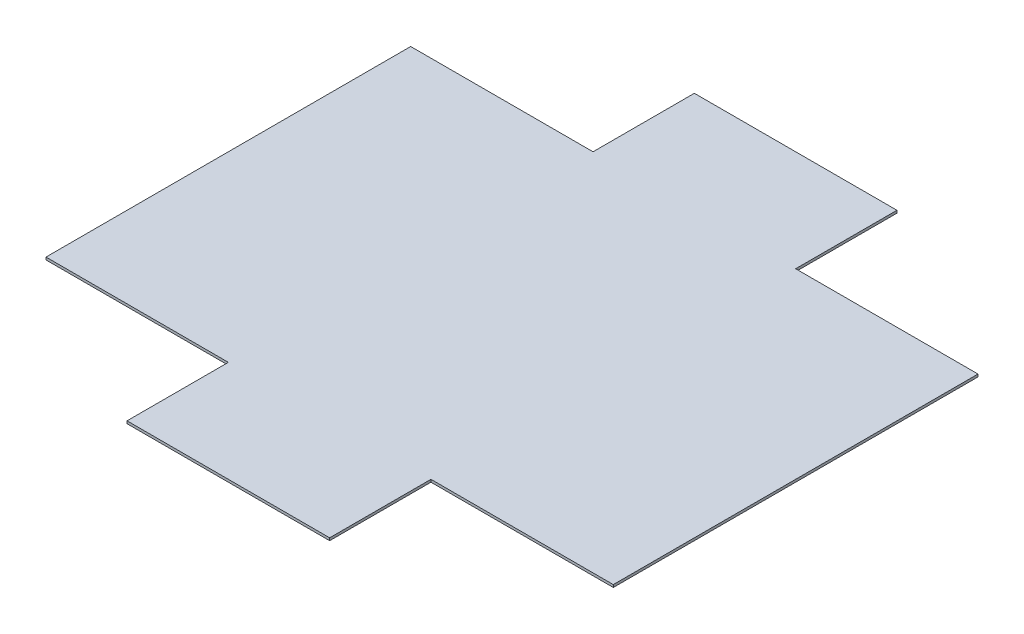
ISO-10303-21;
HEADER;
FILE_DESCRIPTION(('STEP AP214'),'2;1');
FILE_NAME('part.step','',(''),(''),'','','');
FILE_SCHEMA(('AUTOMOTIVE_DESIGN { 1 0 10303 214 1 1 1 1 }'));
ENDSEC;
DATA;
#1=APPLICATION_CONTEXT('core data for automotive mechanical design processes');
#2=APPLICATION_PROTOCOL_DEFINITION('international standard','automotive_design',2000,#1);
#3=PRODUCT_CONTEXT('',#1,'mechanical');
#4=PRODUCT('Part','Part','',(#3));
#5=PRODUCT_RELATED_PRODUCT_CATEGORY('part','',(#4));
#6=PRODUCT_DEFINITION_FORMATION('','',#4);
#7=PRODUCT_DEFINITION_CONTEXT('part definition',#1,'design');
#8=PRODUCT_DEFINITION('design','',#6,#7);
#9=PRODUCT_DEFINITION_SHAPE('','',#8);
#10=(LENGTH_UNIT() NAMED_UNIT(*) SI_UNIT(.MILLI.,.METRE.));
#11=(NAMED_UNIT(*) PLANE_ANGLE_UNIT() SI_UNIT($,.RADIAN.));
#12=(NAMED_UNIT(*) SI_UNIT($,.STERADIAN.) SOLID_ANGLE_UNIT());
#13=UNCERTAINTY_MEASURE_WITH_UNIT(LENGTH_MEASURE(1.E-05),#10,'distance_accuracy_value','');
#14=(GEOMETRIC_REPRESENTATION_CONTEXT(3) GLOBAL_UNCERTAINTY_ASSIGNED_CONTEXT((#13)) GLOBAL_UNIT_ASSIGNED_CONTEXT((#10,
#11,#12)) REPRESENTATION_CONTEXT('',''));
#15=CARTESIAN_POINT('',(0.,0.,0.));
#16=DIRECTION('',(0.,0.,1.));
#17=DIRECTION('',(1.,0.,0.));
#18=AXIS2_PLACEMENT_3D('',#15,#16,#17);
#19=CARTESIAN_POINT('',(0.,3.175,-127.));
#20=DIRECTION('',(1.,0.,0.));
#21=DIRECTION('',(0.,0.,-1.));
#22=AXIS2_PLACEMENT_3D('',#19,#20,#21);
#23=PLANE('',#22);
#24=DIRECTION('',(0.,0.,1.));
#25=VECTOR('',#24,1.);
#26=CARTESIAN_POINT('',(0.,0.,-127.));
#27=LINE('',#26,#25);
#28=CARTESIAN_POINT('',(0.,0.,-584.2));
#29=VERTEX_POINT('',#28);
#30=CARTESIAN_POINT('',(0.,0.,-127.));
#31=VERTEX_POINT('',#30);
#32=EDGE_CURVE('E153',#29,#31,#27,.T.);
#33=ORIENTED_EDGE('',*,*,#32,.T.);
#34=DIRECTION('',(0.,-1.,0.));
#35=VECTOR('',#34,1.);
#36=CARTESIAN_POINT('',(0.,3.175,-127.));
#37=LINE('',#36,#35);
#38=CARTESIAN_POINT('',(0.,3.175,-127.));
#39=VERTEX_POINT('',#38);
#40=EDGE_CURVE('E11',#39,#31,#37,.T.);
#41=ORIENTED_EDGE('',*,*,#40,.F.);
#42=DIRECTION('',(0.,0.,1.));
#43=VECTOR('',#42,1.);
#44=CARTESIAN_POINT('',(0.,3.175,-127.));
#45=LINE('',#44,#43);
#46=CARTESIAN_POINT('',(0.,3.175,-584.2));
#47=VERTEX_POINT('',#46);
#48=EDGE_CURVE('E175',#47,#39,#45,.T.);
#49=ORIENTED_EDGE('',*,*,#48,.F.);
#50=DIRECTION('',(0.,-1.,0.));
#51=VECTOR('',#50,1.);
#52=CARTESIAN_POINT('',(0.,3.175,-584.2));
#53=LINE('',#52,#51);
#54=EDGE_CURVE('E149',#47,#29,#53,.T.);
#55=ORIENTED_EDGE('',*,*,#54,.T.);
#56=EDGE_LOOP('',(#33,#41,#49,#55));
#57=FACE_BOUND('',#56,.T.);
#58=ADVANCED_FACE('F33',(#57),#23,.F.);
#59=CARTESIAN_POINT('',(0.,3.175,-127.));
#60=DIRECTION('',(0.,0.,-1.));
#61=DIRECTION('',(-1.,0.,0.));
#62=AXIS2_PLACEMENT_3D('',#59,#60,#61);
#63=PLANE('',#62);
#64=DIRECTION('',(1.,0.,0.));
#65=VECTOR('',#64,1.);
#66=CARTESIAN_POINT('',(0.,0.,-127.));
#67=LINE('',#66,#65);
#68=CARTESIAN_POINT('',(228.6,0.,-127.));
#69=VERTEX_POINT('',#68);
#70=EDGE_CURVE('E156',#31,#69,#67,.T.);
#71=ORIENTED_EDGE('',*,*,#70,.T.);
#72=DIRECTION('',(0.,-1.,0.));
#73=VECTOR('',#72,1.);
#74=CARTESIAN_POINT('',(228.6,3.175,-127.));
#75=LINE('',#74,#73);
#76=CARTESIAN_POINT('',(228.6,3.175,-127.));
#77=VERTEX_POINT('',#76);
#78=EDGE_CURVE('E41',#77,#69,#75,.T.);
#79=ORIENTED_EDGE('',*,*,#78,.F.);
#80=DIRECTION('',(1.,0.,0.));
#81=VECTOR('',#80,1.);
#82=CARTESIAN_POINT('',(0.,3.175,-127.));
#83=LINE('',#82,#81);
#84=EDGE_CURVE('E104',#39,#77,#83,.T.);
#85=ORIENTED_EDGE('',*,*,#84,.F.);
#86=ORIENTED_EDGE('',*,*,#40,.T.);
#87=EDGE_LOOP('',(#71,#79,#85,#86));
#88=FACE_BOUND('',#87,.T.);
#89=ADVANCED_FACE('F253',(#88),#63,.F.);
#90=CARTESIAN_POINT('',(228.6,3.175,-127.));
#91=DIRECTION('',(1.,0.,0.));
#92=DIRECTION('',(0.,0.,-1.));
#93=AXIS2_PLACEMENT_3D('',#90,#91,#92);
#94=PLANE('',#93);
#95=DIRECTION('',(0.,0.,1.));
#96=VECTOR('',#95,1.);
#97=CARTESIAN_POINT('',(228.6,0.,-127.));
#98=LINE('',#97,#96);
#99=CARTESIAN_POINT('',(228.6,0.,1.11022302462516E-13));
#100=VERTEX_POINT('',#99);
#101=EDGE_CURVE('E158',#69,#100,#98,.T.);
#102=ORIENTED_EDGE('',*,*,#101,.T.);
#103=DIRECTION('',(0.,-1.,0.));
#104=VECTOR('',#103,1.);
#105=CARTESIAN_POINT('',(228.6,3.175,1.11022302462516E-13));
#106=LINE('',#105,#104);
#107=CARTESIAN_POINT('',(228.6,3.175,1.11022302462516E-13));
#108=VERTEX_POINT('',#107);
#109=EDGE_CURVE('E194',#108,#100,#106,.T.);
#110=ORIENTED_EDGE('',*,*,#109,.F.);
#111=DIRECTION('',(0.,0.,1.));
#112=VECTOR('',#111,1.);
#113=CARTESIAN_POINT('',(228.6,3.175,-127.));
#114=LINE('',#113,#112);
#115=EDGE_CURVE('E202',#77,#108,#114,.T.);
#116=ORIENTED_EDGE('',*,*,#115,.F.);
#117=ORIENTED_EDGE('',*,*,#78,.T.);
#118=EDGE_LOOP('',(#102,#110,#116,#117));
#119=FACE_BOUND('',#118,.T.);
#120=ADVANCED_FACE('F200',(#119),#94,.F.);
#121=CARTESIAN_POINT('',(228.6,3.175,1.11022302462516E-13));
#122=DIRECTION('',(0.,0.,-1.));
#123=DIRECTION('',(-1.,0.,0.));
#124=AXIS2_PLACEMENT_3D('',#121,#122,#123);
#125=PLANE('',#124);
#126=DIRECTION('',(1.,0.,0.));
#127=VECTOR('',#126,1.);
#128=CARTESIAN_POINT('',(228.6,0.,1.11022302462516E-13));
#129=LINE('',#128,#127);
#130=CARTESIAN_POINT('',(482.6,0.,1.38777878078145E-13));
#131=VERTEX_POINT('',#130);
#132=EDGE_CURVE('E160',#100,#131,#129,.T.);
#133=ORIENTED_EDGE('',*,*,#132,.T.);
#134=DIRECTION('',(0.,-1.,0.));
#135=VECTOR('',#134,1.);
#136=CARTESIAN_POINT('',(482.6,3.175,1.38777878078145E-13));
#137=LINE('',#136,#135);
#138=CARTESIAN_POINT('',(482.6,3.175,1.38777878078145E-13));
#139=VERTEX_POINT('',#138);
#140=EDGE_CURVE('E191',#139,#131,#137,.T.);
#141=ORIENTED_EDGE('',*,*,#140,.F.);
#142=DIRECTION('',(1.,0.,0.));
#143=VECTOR('',#142,1.);
#144=CARTESIAN_POINT('',(228.6,3.175,1.11022302462516E-13));
#145=LINE('',#144,#143);
#146=EDGE_CURVE('E220',#108,#139,#145,.T.);
#147=ORIENTED_EDGE('',*,*,#146,.F.);
#148=ORIENTED_EDGE('',*,*,#109,.T.);
#149=EDGE_LOOP('',(#133,#141,#147,#148));
#150=FACE_BOUND('',#149,.T.);
#151=ADVANCED_FACE('F211',(#150),#125,.F.);
#152=CARTESIAN_POINT('',(482.6,3.175,-127.));
#153=DIRECTION('',(-1.,0.,0.));
#154=DIRECTION('',(0.,0.,1.));
#155=AXIS2_PLACEMENT_3D('',#152,#153,#154);
#156=PLANE('',#155);
#157=DIRECTION('',(0.,0.,-1.));
#158=VECTOR('',#157,1.);
#159=CARTESIAN_POINT('',(482.6,0.,-127.));
#160=LINE('',#159,#158);
#161=CARTESIAN_POINT('',(482.6,0.,-127.));
#162=VERTEX_POINT('',#161);
#163=EDGE_CURVE('E162',#131,#162,#160,.T.);
#164=ORIENTED_EDGE('',*,*,#163,.T.);
#165=DIRECTION('',(0.,-1.,0.));
#166=VECTOR('',#165,1.);
#167=CARTESIAN_POINT('',(482.6,3.175,-127.));
#168=LINE('',#167,#166);
#169=CARTESIAN_POINT('',(482.6,3.175,-127.));
#170=VERTEX_POINT('',#169);
#171=EDGE_CURVE('E188',#170,#162,#168,.T.);
#172=ORIENTED_EDGE('',*,*,#171,.F.);
#173=DIRECTION('',(0.,0.,-1.));
#174=VECTOR('',#173,1.);
#175=CARTESIAN_POINT('',(482.6,3.175,-127.));
#176=LINE('',#175,#174);
#177=EDGE_CURVE('E217',#139,#170,#176,.T.);
#178=ORIENTED_EDGE('',*,*,#177,.F.);
#179=ORIENTED_EDGE('',*,*,#140,.T.);
#180=EDGE_LOOP('',(#164,#172,#178,#179));
#181=FACE_BOUND('',#180,.T.);
#182=ADVANCED_FACE('F215',(#181),#156,.F.);
#183=CARTESIAN_POINT('',(711.2,3.175,-127.));
#184=DIRECTION('',(0.,0.,-1.));
#185=DIRECTION('',(-1.,0.,0.));
#186=AXIS2_PLACEMENT_3D('',#183,#184,#185);
#187=PLANE('',#186);
#188=DIRECTION('',(1.,0.,0.));
#189=VECTOR('',#188,1.);
#190=CARTESIAN_POINT('',(711.2,0.,-127.));
#191=LINE('',#190,#189);
#192=CARTESIAN_POINT('',(711.2,0.,-127.));
#193=VERTEX_POINT('',#192);
#194=EDGE_CURVE('E164',#162,#193,#191,.T.);
#195=ORIENTED_EDGE('',*,*,#194,.T.);
#196=DIRECTION('',(0.,-1.,0.));
#197=VECTOR('',#196,1.);
#198=CARTESIAN_POINT('',(711.2,3.175,-127.));
#199=LINE('',#198,#197);
#200=CARTESIAN_POINT('',(711.2,3.175,-127.));
#201=VERTEX_POINT('',#200);
#202=EDGE_CURVE('E185',#201,#193,#199,.T.);
#203=ORIENTED_EDGE('',*,*,#202,.F.);
#204=DIRECTION('',(1.,0.,0.));
#205=VECTOR('',#204,1.);
#206=CARTESIAN_POINT('',(711.2,3.175,-127.));
#207=LINE('',#206,#205);
#208=EDGE_CURVE('E219',#170,#201,#207,.T.);
#209=ORIENTED_EDGE('',*,*,#208,.F.);
#210=ORIENTED_EDGE('',*,*,#171,.T.);
#211=EDGE_LOOP('',(#195,#203,#209,#210));
#212=FACE_BOUND('',#211,.T.);
#213=ADVANCED_FACE('F266',(#212),#187,.F.);
#214=CARTESIAN_POINT('',(711.2,3.175,-127.));
#215=DIRECTION('',(-1.,0.,0.));
#216=DIRECTION('',(0.,0.,1.));
#217=AXIS2_PLACEMENT_3D('',#214,#215,#216);
#218=PLANE('',#217);
#219=DIRECTION('',(0.,0.,-1.));
#220=VECTOR('',#219,1.);
#221=CARTESIAN_POINT('',(711.2,0.,-127.));
#222=LINE('',#221,#220);
#223=CARTESIAN_POINT('',(711.2,0.,-584.2));
#224=VERTEX_POINT('',#223);
#225=EDGE_CURVE('E166',#193,#224,#222,.T.);
#226=ORIENTED_EDGE('',*,*,#225,.T.);
#227=DIRECTION('',(0.,-1.,0.));
#228=VECTOR('',#227,1.);
#229=CARTESIAN_POINT('',(711.2,3.175,-584.2));
#230=LINE('',#229,#228);
#231=CARTESIAN_POINT('',(711.2,3.175,-584.2));
#232=VERTEX_POINT('',#231);
#233=EDGE_CURVE('E182',#232,#224,#230,.T.);
#234=ORIENTED_EDGE('',*,*,#233,.F.);
#235=DIRECTION('',(0.,0.,-1.));
#236=VECTOR('',#235,1.);
#237=CARTESIAN_POINT('',(711.2,3.175,-127.));
#238=LINE('',#237,#236);
#239=EDGE_CURVE('E222',#201,#232,#238,.T.);
#240=ORIENTED_EDGE('',*,*,#239,.F.);
#241=ORIENTED_EDGE('',*,*,#202,.T.);
#242=EDGE_LOOP('',(#226,#234,#240,#241));
#243=FACE_BOUND('',#242,.T.);
#244=ADVANCED_FACE('F269',(#243),#218,.F.);
#245=CARTESIAN_POINT('',(482.6,3.175,-584.2));
#246=DIRECTION('',(0.,0.,1.));
#247=DIRECTION('',(1.,0.,0.));
#248=AXIS2_PLACEMENT_3D('',#245,#246,#247);
#249=PLANE('',#248);
#250=DIRECTION('',(-1.,0.,0.));
#251=VECTOR('',#250,1.);
#252=CARTESIAN_POINT('',(482.6,0.,-584.2));
#253=LINE('',#252,#251);
#254=CARTESIAN_POINT('',(482.6,0.,-584.2));
#255=VERTEX_POINT('',#254);
#256=EDGE_CURVE('E168',#224,#255,#253,.T.);
#257=ORIENTED_EDGE('',*,*,#256,.T.);
#258=DIRECTION('',(0.,-1.,0.));
#259=VECTOR('',#258,1.);
#260=CARTESIAN_POINT('',(482.6,3.175,-584.2));
#261=LINE('',#260,#259);
#262=CARTESIAN_POINT('',(482.6,3.175,-584.2));
#263=VERTEX_POINT('',#262);
#264=EDGE_CURVE('E179',#263,#255,#261,.T.);
#265=ORIENTED_EDGE('',*,*,#264,.F.);
#266=DIRECTION('',(-1.,0.,0.));
#267=VECTOR('',#266,1.);
#268=CARTESIAN_POINT('',(482.6,3.175,-584.2));
#269=LINE('',#268,#267);
#270=EDGE_CURVE('E228',#232,#263,#269,.T.);
#271=ORIENTED_EDGE('',*,*,#270,.F.);
#272=ORIENTED_EDGE('',*,*,#233,.T.);
#273=EDGE_LOOP('',(#257,#265,#271,#272));
#274=FACE_BOUND('',#273,.T.);
#275=ADVANCED_FACE('F234',(#274),#249,.F.);
#276=CARTESIAN_POINT('',(482.6,3.175,-711.2));
#277=DIRECTION('',(-1.,0.,0.));
#278=DIRECTION('',(0.,0.,1.));
#279=AXIS2_PLACEMENT_3D('',#276,#277,#278);
#280=PLANE('',#279);
#281=DIRECTION('',(0.,0.,-1.));
#282=VECTOR('',#281,1.);
#283=CARTESIAN_POINT('',(482.6,0.,-711.2));
#284=LINE('',#283,#282);
#285=CARTESIAN_POINT('',(482.6,0.,-711.2));
#286=VERTEX_POINT('',#285);
#287=EDGE_CURVE('E170',#255,#286,#284,.T.);
#288=ORIENTED_EDGE('',*,*,#287,.T.);
#289=DIRECTION('',(0.,-1.,0.));
#290=VECTOR('',#289,1.);
#291=CARTESIAN_POINT('',(482.6,3.175,-711.2));
#292=LINE('',#291,#290);
#293=CARTESIAN_POINT('',(482.6,3.175,-711.2));
#294=VERTEX_POINT('',#293);
#295=EDGE_CURVE('E144',#294,#286,#292,.T.);
#296=ORIENTED_EDGE('',*,*,#295,.F.);
#297=DIRECTION('',(0.,0.,-1.));
#298=VECTOR('',#297,1.);
#299=CARTESIAN_POINT('',(482.6,3.175,-711.2));
#300=LINE('',#299,#298);
#301=EDGE_CURVE('E135',#263,#294,#300,.T.);
#302=ORIENTED_EDGE('',*,*,#301,.F.);
#303=ORIENTED_EDGE('',*,*,#264,.T.);
#304=EDGE_LOOP('',(#288,#296,#302,#303));
#305=FACE_BOUND('',#304,.T.);
#306=ADVANCED_FACE('F238',(#305),#280,.F.);
#307=CARTESIAN_POINT('',(228.6,3.175,-711.2));
#308=DIRECTION('',(0.,0.,1.));
#309=DIRECTION('',(1.,0.,0.));
#310=AXIS2_PLACEMENT_3D('',#307,#308,#309);
#311=PLANE('',#310);
#312=DIRECTION('',(-1.,0.,0.));
#313=VECTOR('',#312,1.);
#314=CARTESIAN_POINT('',(228.6,0.,-711.2));
#315=LINE('',#314,#313);
#316=CARTESIAN_POINT('',(228.6,0.,-711.2));
#317=VERTEX_POINT('',#316);
#318=EDGE_CURVE('E143',#286,#317,#315,.T.);
#319=ORIENTED_EDGE('',*,*,#318,.T.);
#320=DIRECTION('',(0.,-1.,0.));
#321=VECTOR('',#320,1.);
#322=CARTESIAN_POINT('',(228.6,3.175,-711.2));
#323=LINE('',#322,#321);
#324=CARTESIAN_POINT('',(228.6,3.175,-711.2));
#325=VERTEX_POINT('',#324);
#326=EDGE_CURVE('E140',#325,#317,#323,.T.);
#327=ORIENTED_EDGE('',*,*,#326,.F.);
#328=DIRECTION('',(-1.,0.,0.));
#329=VECTOR('',#328,1.);
#330=CARTESIAN_POINT('',(228.6,3.175,-711.2));
#331=LINE('',#330,#329);
#332=EDGE_CURVE('E129',#294,#325,#331,.T.);
#333=ORIENTED_EDGE('',*,*,#332,.F.);
#334=ORIENTED_EDGE('',*,*,#295,.T.);
#335=EDGE_LOOP('',(#319,#327,#333,#334));
#336=FACE_BOUND('',#335,.T.);
#337=ADVANCED_FACE('F141',(#336),#311,.F.);
#338=CARTESIAN_POINT('',(228.6,3.175,-584.2));
#339=DIRECTION('',(1.,0.,0.));
#340=DIRECTION('',(0.,0.,-1.));
#341=AXIS2_PLACEMENT_3D('',#338,#339,#340);
#342=PLANE('',#341);
#343=DIRECTION('',(0.,0.,1.));
#344=VECTOR('',#343,1.);
#345=CARTESIAN_POINT('',(228.6,0.,-584.2));
#346=LINE('',#345,#344);
#347=CARTESIAN_POINT('',(228.6,0.,-584.2));
#348=VERTEX_POINT('',#347);
#349=EDGE_CURVE('E90',#317,#348,#346,.T.);
#350=ORIENTED_EDGE('',*,*,#349,.T.);
#351=DIRECTION('',(0.,-1.,0.));
#352=VECTOR('',#351,1.);
#353=CARTESIAN_POINT('',(228.6,3.175,-584.2));
#354=LINE('',#353,#352);
#355=CARTESIAN_POINT('',(228.6,3.175,-584.2));
#356=VERTEX_POINT('',#355);
#357=EDGE_CURVE('E145',#356,#348,#354,.T.);
#358=ORIENTED_EDGE('',*,*,#357,.F.);
#359=DIRECTION('',(0.,0.,1.));
#360=VECTOR('',#359,1.);
#361=CARTESIAN_POINT('',(228.6,3.175,-584.2));
#362=LINE('',#361,#360);
#363=EDGE_CURVE('E133',#325,#356,#362,.T.);
#364=ORIENTED_EDGE('',*,*,#363,.F.);
#365=ORIENTED_EDGE('',*,*,#326,.T.);
#366=EDGE_LOOP('',(#350,#358,#364,#365));
#367=FACE_BOUND('',#366,.T.);
#368=ADVANCED_FACE('F147',(#367),#342,.F.);
#369=CARTESIAN_POINT('',(0.,3.175,-584.2));
#370=DIRECTION('',(0.,0.,1.));
#371=DIRECTION('',(1.,0.,0.));
#372=AXIS2_PLACEMENT_3D('',#369,#370,#371);
#373=PLANE('',#372);
#374=DIRECTION('',(-1.,0.,0.));
#375=VECTOR('',#374,1.);
#376=CARTESIAN_POINT('',(0.,0.,-584.2));
#377=LINE('',#376,#375);
#378=EDGE_CURVE('E96',#348,#29,#377,.T.);
#379=ORIENTED_EDGE('',*,*,#378,.T.);
#380=ORIENTED_EDGE('',*,*,#54,.F.);
#381=DIRECTION('',(-1.,0.,0.));
#382=VECTOR('',#381,1.);
#383=CARTESIAN_POINT('',(0.,3.175,-584.2));
#384=LINE('',#383,#382);
#385=EDGE_CURVE('E49',#356,#47,#384,.T.);
#386=ORIENTED_EDGE('',*,*,#385,.F.);
#387=ORIENTED_EDGE('',*,*,#357,.T.);
#388=EDGE_LOOP('',(#379,#380,#386,#387));
#389=FACE_BOUND('',#388,.T.);
#390=ADVANCED_FACE('F242',(#389),#373,.F.);
#391=CARTESIAN_POINT('',(0.,3.175,0.));
#392=DIRECTION('',(0.,-1.,0.));
#393=DIRECTION('',(0.,0.,-1.));
#394=AXIS2_PLACEMENT_3D('',#391,#392,#393);
#395=PLANE('',#394);
#396=ORIENTED_EDGE('',*,*,#48,.T.);
#397=ORIENTED_EDGE('',*,*,#84,.T.);
#398=ORIENTED_EDGE('',*,*,#115,.T.);
#399=ORIENTED_EDGE('',*,*,#146,.T.);
#400=ORIENTED_EDGE('',*,*,#177,.T.);
#401=ORIENTED_EDGE('',*,*,#208,.T.);
#402=ORIENTED_EDGE('',*,*,#239,.T.);
#403=ORIENTED_EDGE('',*,*,#270,.T.);
#404=ORIENTED_EDGE('',*,*,#301,.T.);
#405=ORIENTED_EDGE('',*,*,#332,.T.);
#406=ORIENTED_EDGE('',*,*,#363,.T.);
#407=ORIENTED_EDGE('',*,*,#385,.T.);
#408=EDGE_LOOP('',(#396,#397,#398,#399,#400,#401,#402,#403,#404,#405,#406,#407));
#409=FACE_BOUND('',#408,.T.);
#410=ADVANCED_FACE('F131',(#409),#395,.F.);
#411=CARTESIAN_POINT('',(0.,0.,0.));
#412=DIRECTION('',(0.,-1.,0.));
#413=DIRECTION('',(0.,0.,-1.));
#414=AXIS2_PLACEMENT_3D('',#411,#412,#413);
#415=PLANE('',#414);
#416=ORIENTED_EDGE('',*,*,#32,.F.);
#417=ORIENTED_EDGE('',*,*,#378,.F.);
#418=ORIENTED_EDGE('',*,*,#349,.F.);
#419=ORIENTED_EDGE('',*,*,#318,.F.);
#420=ORIENTED_EDGE('',*,*,#287,.F.);
#421=ORIENTED_EDGE('',*,*,#256,.F.);
#422=ORIENTED_EDGE('',*,*,#225,.F.);
#423=ORIENTED_EDGE('',*,*,#194,.F.);
#424=ORIENTED_EDGE('',*,*,#163,.F.);
#425=ORIENTED_EDGE('',*,*,#132,.F.);
#426=ORIENTED_EDGE('',*,*,#101,.F.);
#427=ORIENTED_EDGE('',*,*,#70,.F.);
#428=EDGE_LOOP('',(#416,#417,#418,#419,#420,#421,#422,#423,#424,#425,#426,#427));
#429=FACE_BOUND('',#428,.T.);
#430=ADVANCED_FACE('F206',(#429),#415,.T.);
#431=CLOSED_SHELL('',(#58,#89,#120,#151,#182,#213,#244,#275,#306,#337,#368,#390,#410,#430));
#432=MANIFOLD_SOLID_BREP('B2',#431);
#433=ADVANCED_BREP_SHAPE_REPRESENTATION('',(#18,#432),#14);
#434=SHAPE_DEFINITION_REPRESENTATION(#9,#433);
ENDSEC;
END-ISO-10303-21;
